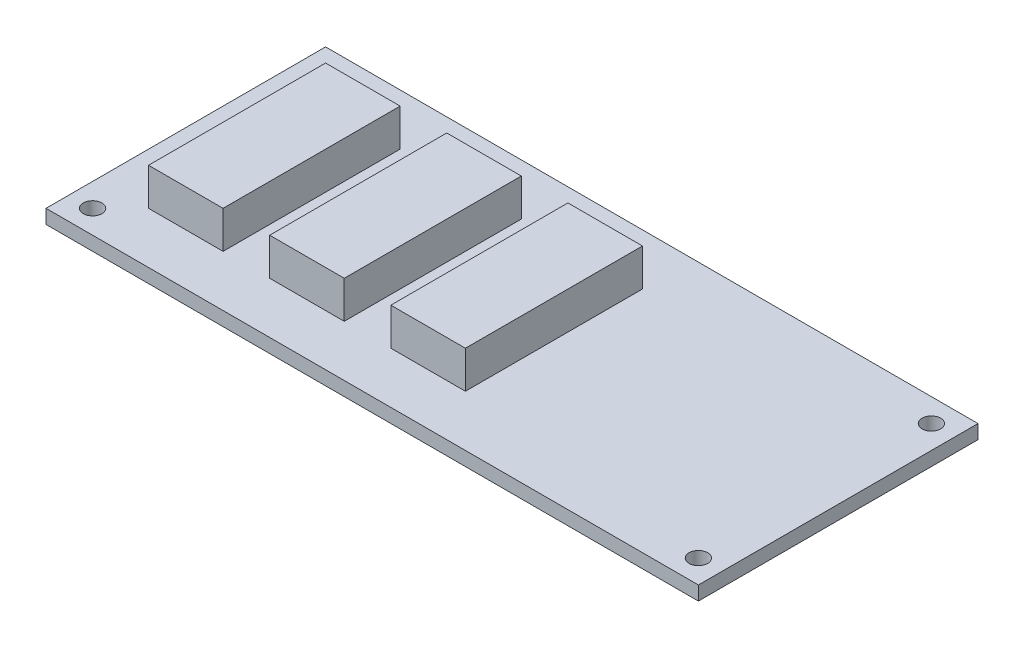
ISO-10303-21;
HEADER;
FILE_DESCRIPTION(('STEP AP214'),'2;1');
FILE_NAME('part.step','',(''),(''),'','','');
FILE_SCHEMA(('AUTOMOTIVE_DESIGN { 1 0 10303 214 1 1 1 1 }'));
ENDSEC;
DATA;
#1=APPLICATION_CONTEXT('core data for automotive mechanical design processes');
#2=APPLICATION_PROTOCOL_DEFINITION('international standard','automotive_design',2000,#1);
#3=PRODUCT_CONTEXT('',#1,'mechanical');
#4=PRODUCT('Part','Part','',(#3));
#5=PRODUCT_RELATED_PRODUCT_CATEGORY('part','',(#4));
#6=PRODUCT_DEFINITION_FORMATION('','',#4);
#7=PRODUCT_DEFINITION_CONTEXT('part definition',#1,'design');
#8=PRODUCT_DEFINITION('design','',#6,#7);
#9=PRODUCT_DEFINITION_SHAPE('','',#8);
#10=(LENGTH_UNIT() NAMED_UNIT(*) SI_UNIT(.MILLI.,.METRE.));
#11=(NAMED_UNIT(*) PLANE_ANGLE_UNIT() SI_UNIT($,.RADIAN.));
#12=(NAMED_UNIT(*) SI_UNIT($,.STERADIAN.) SOLID_ANGLE_UNIT());
#13=UNCERTAINTY_MEASURE_WITH_UNIT(LENGTH_MEASURE(1.E-05),#10,'distance_accuracy_value','');
#14=(GEOMETRIC_REPRESENTATION_CONTEXT(3) GLOBAL_UNCERTAINTY_ASSIGNED_CONTEXT((#13)) GLOBAL_UNIT_ASSIGNED_CONTEXT((#10,
#11,#12)) REPRESENTATION_CONTEXT('',''));
#15=CARTESIAN_POINT('',(0.,0.,0.));
#16=DIRECTION('',(0.,0.,1.));
#17=DIRECTION('',(1.,0.,0.));
#18=AXIS2_PLACEMENT_3D('',#15,#16,#17);
#19=CARTESIAN_POINT('',(0.,1.5,0.));
#20=DIRECTION('',(0.,1.,0.));
#21=DIRECTION('',(0.,0.,1.));
#22=AXIS2_PLACEMENT_3D('',#19,#20,#21);
#23=PLANE('',#22);
#24=CARTESIAN_POINT('',(32.5,1.5,12.5));
#25=DIRECTION('',(0.,1.,0.));
#26=DIRECTION('',(0.,0.,1.));
#27=AXIS2_PLACEMENT_3D('',#24,#25,#26);
#28=CIRCLE('',#27,0.999999999999998);
#29=CARTESIAN_POINT('',(32.5,1.5,13.5));
#30=VERTEX_POINT('',#29);
#31=EDGE_CURVE('E239',#30,#30,#28,.T.);
#32=ORIENTED_EDGE('',*,*,#31,.F.);
#33=EDGE_LOOP('',(#32));
#34=FACE_BOUND('',#33,.T.);
#35=CARTESIAN_POINT('',(-32.5,1.5,-12.5));
#36=DIRECTION('',(0.,1.,0.));
#37=DIRECTION('',(0.,0.,1.));
#38=AXIS2_PLACEMENT_3D('',#35,#36,#37);
#39=CIRCLE('',#38,0.999999999999998);
#40=CARTESIAN_POINT('',(-32.5,1.5,-11.5));
#41=VERTEX_POINT('',#40);
#42=EDGE_CURVE('E251',#41,#41,#39,.T.);
#43=ORIENTED_EDGE('',*,*,#42,.F.);
#44=EDGE_LOOP('',(#43));
#45=FACE_BOUND('',#44,.T.);
#46=DIRECTION('',(0.,0.,-1.));
#47=VECTOR('',#46,1.);
#48=CARTESIAN_POINT('',(35.,1.5,-15.));
#49=LINE('',#48,#47);
#50=CARTESIAN_POINT('',(35.,1.5,15.));
#51=VERTEX_POINT('',#50);
#52=CARTESIAN_POINT('',(35.,1.5,-15.));
#53=VERTEX_POINT('',#52);
#54=EDGE_CURVE('E257',#51,#53,#49,.T.);
#55=ORIENTED_EDGE('',*,*,#54,.T.);
#56=DIRECTION('',(-1.,0.,0.));
#57=VECTOR('',#56,1.);
#58=CARTESIAN_POINT('',(-35.,1.5,-15.));
#59=LINE('',#58,#57);
#60=CARTESIAN_POINT('',(-35.,1.5,-15.));
#61=VERTEX_POINT('',#60);
#62=EDGE_CURVE('E260',#53,#61,#59,.T.);
#63=ORIENTED_EDGE('',*,*,#62,.T.);
#64=DIRECTION('',(0.,0.,1.));
#65=VECTOR('',#64,1.);
#66=CARTESIAN_POINT('',(-35.,1.5,-15.));
#67=LINE('',#66,#65);
#68=CARTESIAN_POINT('',(-35.,1.5,15.));
#69=VERTEX_POINT('',#68);
#70=EDGE_CURVE('E263',#61,#69,#67,.T.);
#71=ORIENTED_EDGE('',*,*,#70,.T.);
#72=DIRECTION('',(1.,0.,0.));
#73=VECTOR('',#72,1.);
#74=CARTESIAN_POINT('',(-35.,1.5,15.));
#75=LINE('',#74,#73);
#76=EDGE_CURVE('E265',#69,#51,#75,.T.);
#77=ORIENTED_EDGE('',*,*,#76,.T.);
#78=EDGE_LOOP('',(#55,#63,#71,#77));
#79=FACE_BOUND('',#78,.T.);
#80=CARTESIAN_POINT('',(32.5,1.5,-12.5));
#81=DIRECTION('',(0.,1.,0.));
#82=DIRECTION('',(0.,0.,1.));
#83=AXIS2_PLACEMENT_3D('',#80,#81,#82);
#84=CIRCLE('',#83,0.999999999999998);
#85=CARTESIAN_POINT('',(32.5,1.5,-11.5));
#86=VERTEX_POINT('',#85);
#87=EDGE_CURVE('E245',#86,#86,#84,.T.);
#88=ORIENTED_EDGE('',*,*,#87,.F.);
#89=EDGE_LOOP('',(#88));
#90=FACE_BOUND('',#89,.T.);
#91=CARTESIAN_POINT('',(-32.5,1.5,12.5));
#92=DIRECTION('',(0.,1.,0.));
#93=DIRECTION('',(0.,0.,1.));
#94=AXIS2_PLACEMENT_3D('',#91,#92,#93);
#95=CIRCLE('',#94,0.999999999999998);
#96=CARTESIAN_POINT('',(-32.5,1.5,13.5));
#97=VERTEX_POINT('',#96);
#98=EDGE_CURVE('E233',#97,#97,#95,.T.);
#99=ORIENTED_EDGE('',*,*,#98,.F.);
#100=EDGE_LOOP('',(#99));
#101=FACE_BOUND('',#100,.T.);
#102=DIRECTION('',(-1.,0.,0.));
#103=VECTOR('',#102,1.);
#104=CARTESIAN_POINT('',(-29.5,1.5,-9.5));
#105=LINE('',#104,#103);
#106=CARTESIAN_POINT('',(-21.5,1.5,-9.5));
#107=VERTEX_POINT('',#106);
#108=CARTESIAN_POINT('',(-29.5,1.5,-9.5));
#109=VERTEX_POINT('',#108);
#110=EDGE_CURVE('E217',#107,#109,#105,.T.);
#111=ORIENTED_EDGE('',*,*,#110,.F.);
#112=DIRECTION('',(0.,0.,-1.));
#113=VECTOR('',#112,1.);
#114=CARTESIAN_POINT('',(-21.5,1.5,-9.5));
#115=LINE('',#114,#113);
#116=CARTESIAN_POINT('',(-21.5,1.5,9.5));
#117=VERTEX_POINT('',#116);
#118=EDGE_CURVE('E203',#117,#107,#115,.T.);
#119=ORIENTED_EDGE('',*,*,#118,.F.);
#120=DIRECTION('',(1.,0.,0.));
#121=VECTOR('',#120,1.);
#122=CARTESIAN_POINT('',(-29.5,1.5,9.5));
#123=LINE('',#122,#121);
#124=CARTESIAN_POINT('',(-29.5,1.5,9.5));
#125=VERTEX_POINT('',#124);
#126=EDGE_CURVE('E208',#125,#117,#123,.T.);
#127=ORIENTED_EDGE('',*,*,#126,.F.);
#128=DIRECTION('',(0.,0.,1.));
#129=VECTOR('',#128,1.);
#130=CARTESIAN_POINT('',(-29.5,1.5,-9.5));
#131=LINE('',#130,#129);
#132=EDGE_CURVE('E219',#109,#125,#131,.T.);
#133=ORIENTED_EDGE('',*,*,#132,.F.);
#134=EDGE_LOOP('',(#111,#119,#127,#133));
#135=FACE_BOUND('',#134,.T.);
#136=DIRECTION('',(-1.,0.,0.));
#137=VECTOR('',#136,1.);
#138=CARTESIAN_POINT('',(-16.5,1.5,-9.5));
#139=LINE('',#138,#137);
#140=CARTESIAN_POINT('',(-8.50000000000001,1.5,-9.5));
#141=VERTEX_POINT('',#140);
#142=CARTESIAN_POINT('',(-16.5,1.5,-9.5));
#143=VERTEX_POINT('',#142);
#144=EDGE_CURVE('E175',#141,#143,#139,.T.);
#145=ORIENTED_EDGE('',*,*,#144,.F.);
#146=DIRECTION('',(0.,0.,-1.));
#147=VECTOR('',#146,1.);
#148=CARTESIAN_POINT('',(-8.50000000000001,1.5,-9.5));
#149=LINE('',#148,#147);
#150=CARTESIAN_POINT('',(-8.50000000000001,1.5,9.5));
#151=VERTEX_POINT('',#150);
#152=EDGE_CURVE('E172',#151,#141,#149,.T.);
#153=ORIENTED_EDGE('',*,*,#152,.F.);
#154=DIRECTION('',(1.,0.,0.));
#155=VECTOR('',#154,1.);
#156=CARTESIAN_POINT('',(-16.5,1.5,9.5));
#157=LINE('',#156,#155);
#158=CARTESIAN_POINT('',(-16.5,1.5,9.5));
#159=VERTEX_POINT('',#158);
#160=EDGE_CURVE('E184',#159,#151,#157,.T.);
#161=ORIENTED_EDGE('',*,*,#160,.F.);
#162=DIRECTION('',(0.,0.,1.));
#163=VECTOR('',#162,1.);
#164=CARTESIAN_POINT('',(-16.5,1.5,-9.5));
#165=LINE('',#164,#163);
#166=EDGE_CURVE('E192',#143,#159,#165,.T.);
#167=ORIENTED_EDGE('',*,*,#166,.F.);
#168=EDGE_LOOP('',(#145,#153,#161,#167));
#169=FACE_BOUND('',#168,.T.);
#170=DIRECTION('',(-1.,0.,0.));
#171=VECTOR('',#170,1.);
#172=CARTESIAN_POINT('',(-3.50000000000001,1.5,-9.5));
#173=LINE('',#172,#171);
#174=CARTESIAN_POINT('',(4.49999999999999,1.5,-9.5));
#175=VERTEX_POINT('',#174);
#176=CARTESIAN_POINT('',(-3.50000000000001,1.5,-9.5));
#177=VERTEX_POINT('',#176);
#178=EDGE_CURVE('E550',#175,#177,#173,.T.);
#179=ORIENTED_EDGE('',*,*,#178,.F.);
#180=DIRECTION('',(0.,0.,-1.));
#181=VECTOR('',#180,1.);
#182=CARTESIAN_POINT('',(4.49999999999999,1.5,-9.5));
#183=LINE('',#182,#181);
#184=CARTESIAN_POINT('',(4.49999999999999,1.5,9.5));
#185=VERTEX_POINT('',#184);
#186=EDGE_CURVE('E170',#185,#175,#183,.T.);
#187=ORIENTED_EDGE('',*,*,#186,.F.);
#188=DIRECTION('',(1.,0.,0.));
#189=VECTOR('',#188,1.);
#190=CARTESIAN_POINT('',(-3.50000000000001,1.5,9.5));
#191=LINE('',#190,#189);
#192=CARTESIAN_POINT('',(-3.50000000000001,1.5,9.5));
#193=VERTEX_POINT('',#192);
#194=EDGE_CURVE('E166',#193,#185,#191,.T.);
#195=ORIENTED_EDGE('',*,*,#194,.F.);
#196=DIRECTION('',(0.,0.,1.));
#197=VECTOR('',#196,1.);
#198=CARTESIAN_POINT('',(-3.50000000000001,1.5,-9.5));
#199=LINE('',#198,#197);
#200=EDGE_CURVE('E547',#177,#193,#199,.T.);
#201=ORIENTED_EDGE('',*,*,#200,.F.);
#202=EDGE_LOOP('',(#179,#187,#195,#201));
#203=FACE_BOUND('',#202,.T.);
#204=ADVANCED_FACE('F33',(#34,#45,#79,#90,#101,#135,#169,#203),#23,.T.);
#205=CARTESIAN_POINT('',(0.,0.,0.));
#206=DIRECTION('',(0.,1.,0.));
#207=DIRECTION('',(0.,0.,1.));
#208=AXIS2_PLACEMENT_3D('',#205,#206,#207);
#209=PLANE('',#208);
#210=DIRECTION('',(0.,0.,-1.));
#211=VECTOR('',#210,1.);
#212=CARTESIAN_POINT('',(35.,0.,-15.));
#213=LINE('',#212,#211);
#214=CARTESIAN_POINT('',(35.,0.,15.));
#215=VERTEX_POINT('',#214);
#216=CARTESIAN_POINT('',(35.,0.,-15.));
#217=VERTEX_POINT('',#216);
#218=EDGE_CURVE('E254',#215,#217,#213,.T.);
#219=ORIENTED_EDGE('',*,*,#218,.F.);
#220=DIRECTION('',(1.,0.,0.));
#221=VECTOR('',#220,1.);
#222=CARTESIAN_POINT('',(-35.,0.,15.));
#223=LINE('',#222,#221);
#224=CARTESIAN_POINT('',(-35.,0.,15.));
#225=VERTEX_POINT('',#224);
#226=EDGE_CURVE('E261',#225,#215,#223,.T.);
#227=ORIENTED_EDGE('',*,*,#226,.F.);
#228=DIRECTION('',(0.,0.,1.));
#229=VECTOR('',#228,1.);
#230=CARTESIAN_POINT('',(-35.,0.,-15.));
#231=LINE('',#230,#229);
#232=CARTESIAN_POINT('',(-35.,0.,-15.));
#233=VERTEX_POINT('',#232);
#234=EDGE_CURVE('E272',#233,#225,#231,.T.);
#235=ORIENTED_EDGE('',*,*,#234,.F.);
#236=DIRECTION('',(-1.,0.,0.));
#237=VECTOR('',#236,1.);
#238=CARTESIAN_POINT('',(-35.,0.,-15.));
#239=LINE('',#238,#237);
#240=EDGE_CURVE('E270',#217,#233,#239,.T.);
#241=ORIENTED_EDGE('',*,*,#240,.F.);
#242=EDGE_LOOP('',(#219,#227,#235,#241));
#243=FACE_BOUND('',#242,.T.);
#244=CARTESIAN_POINT('',(-32.5,0.,-12.5));
#245=DIRECTION('',(0.,1.,0.));
#246=DIRECTION('',(0.,0.,1.));
#247=AXIS2_PLACEMENT_3D('',#244,#245,#246);
#248=CIRCLE('',#247,0.999999999999998);
#249=CARTESIAN_POINT('',(-32.5,0.,-11.5));
#250=VERTEX_POINT('',#249);
#251=EDGE_CURVE('E248',#250,#250,#248,.T.);
#252=ORIENTED_EDGE('',*,*,#251,.T.);
#253=EDGE_LOOP('',(#252));
#254=FACE_BOUND('',#253,.T.);
#255=CARTESIAN_POINT('',(32.5,0.,-12.5));
#256=DIRECTION('',(0.,1.,0.));
#257=DIRECTION('',(0.,0.,1.));
#258=AXIS2_PLACEMENT_3D('',#255,#256,#257);
#259=CIRCLE('',#258,0.999999999999998);
#260=CARTESIAN_POINT('',(32.5,0.,-11.5));
#261=VERTEX_POINT('',#260);
#262=EDGE_CURVE('E242',#261,#261,#259,.T.);
#263=ORIENTED_EDGE('',*,*,#262,.T.);
#264=EDGE_LOOP('',(#263));
#265=FACE_BOUND('',#264,.T.);
#266=CARTESIAN_POINT('',(32.5,0.,12.5));
#267=DIRECTION('',(0.,1.,0.));
#268=DIRECTION('',(0.,0.,1.));
#269=AXIS2_PLACEMENT_3D('',#266,#267,#268);
#270=CIRCLE('',#269,0.999999999999998);
#271=CARTESIAN_POINT('',(32.5,0.,13.5));
#272=VERTEX_POINT('',#271);
#273=EDGE_CURVE('E236',#272,#272,#270,.T.);
#274=ORIENTED_EDGE('',*,*,#273,.T.);
#275=EDGE_LOOP('',(#274));
#276=FACE_BOUND('',#275,.T.);
#277=CARTESIAN_POINT('',(-32.5,0.,12.5));
#278=DIRECTION('',(0.,1.,0.));
#279=DIRECTION('',(0.,0.,1.));
#280=AXIS2_PLACEMENT_3D('',#277,#278,#279);
#281=CIRCLE('',#280,0.999999999999998);
#282=CARTESIAN_POINT('',(-32.5,0.,13.5));
#283=VERTEX_POINT('',#282);
#284=EDGE_CURVE('E232',#283,#283,#281,.T.);
#285=ORIENTED_EDGE('',*,*,#284,.T.);
#286=EDGE_LOOP('',(#285));
#287=FACE_BOUND('',#286,.T.);
#288=ADVANCED_FACE('F290',(#243,#254,#265,#276,#287),#209,.F.);
#289=CARTESIAN_POINT('',(35.,1.5,-15.));
#290=DIRECTION('',(-1.,0.,0.));
#291=DIRECTION('',(0.,0.,1.));
#292=AXIS2_PLACEMENT_3D('',#289,#290,#291);
#293=PLANE('',#292);
#294=ORIENTED_EDGE('',*,*,#218,.T.);
#295=DIRECTION('',(0.,-1.,0.));
#296=VECTOR('',#295,1.);
#297=CARTESIAN_POINT('',(35.,1.5,-15.));
#298=LINE('',#297,#296);
#299=EDGE_CURVE('E11',#53,#217,#298,.T.);
#300=ORIENTED_EDGE('',*,*,#299,.F.);
#301=ORIENTED_EDGE('',*,*,#54,.F.);
#302=DIRECTION('',(0.,-1.,0.));
#303=VECTOR('',#302,1.);
#304=CARTESIAN_POINT('',(35.,1.5,15.));
#305=LINE('',#304,#303);
#306=EDGE_CURVE('E267',#51,#215,#305,.T.);
#307=ORIENTED_EDGE('',*,*,#306,.T.);
#308=EDGE_LOOP('',(#294,#300,#301,#307));
#309=FACE_BOUND('',#308,.T.);
#310=ADVANCED_FACE('F35',(#309),#293,.F.);
#311=CARTESIAN_POINT('',(-35.,1.5,-15.));
#312=DIRECTION('',(0.,0.,1.));
#313=DIRECTION('',(1.,0.,0.));
#314=AXIS2_PLACEMENT_3D('',#311,#312,#313);
#315=PLANE('',#314);
#316=ORIENTED_EDGE('',*,*,#240,.T.);
#317=DIRECTION('',(0.,-1.,0.));
#318=VECTOR('',#317,1.);
#319=CARTESIAN_POINT('',(-35.,1.5,-15.));
#320=LINE('',#319,#318);
#321=EDGE_CURVE('E41',#61,#233,#320,.T.);
#322=ORIENTED_EDGE('',*,*,#321,.F.);
#323=ORIENTED_EDGE('',*,*,#62,.F.);
#324=ORIENTED_EDGE('',*,*,#299,.T.);
#325=EDGE_LOOP('',(#316,#322,#323,#324));
#326=FACE_BOUND('',#325,.T.);
#327=ADVANCED_FACE('F301',(#326),#315,.F.);
#328=CARTESIAN_POINT('',(-35.,1.5,-15.));
#329=DIRECTION('',(1.,0.,0.));
#330=DIRECTION('',(0.,0.,-1.));
#331=AXIS2_PLACEMENT_3D('',#328,#329,#330);
#332=PLANE('',#331);
#333=ORIENTED_EDGE('',*,*,#234,.T.);
#334=DIRECTION('',(0.,-1.,0.));
#335=VECTOR('',#334,1.);
#336=CARTESIAN_POINT('',(-35.,1.5,15.));
#337=LINE('',#336,#335);
#338=EDGE_CURVE('E277',#69,#225,#337,.T.);
#339=ORIENTED_EDGE('',*,*,#338,.F.);
#340=ORIENTED_EDGE('',*,*,#70,.F.);
#341=ORIENTED_EDGE('',*,*,#321,.T.);
#342=EDGE_LOOP('',(#333,#339,#340,#341));
#343=FACE_BOUND('',#342,.T.);
#344=ADVANCED_FACE('F284',(#343),#332,.F.);
#345=CARTESIAN_POINT('',(-35.,1.5,15.));
#346=DIRECTION('',(0.,0.,-1.));
#347=DIRECTION('',(-1.,0.,0.));
#348=AXIS2_PLACEMENT_3D('',#345,#346,#347);
#349=PLANE('',#348);
#350=ORIENTED_EDGE('',*,*,#226,.T.);
#351=ORIENTED_EDGE('',*,*,#306,.F.);
#352=ORIENTED_EDGE('',*,*,#76,.F.);
#353=ORIENTED_EDGE('',*,*,#338,.T.);
#354=EDGE_LOOP('',(#350,#351,#352,#353));
#355=FACE_BOUND('',#354,.T.);
#356=ADVANCED_FACE('F294',(#355),#349,.F.);
#357=CARTESIAN_POINT('',(-32.5,1.5,-12.5));
#358=DIRECTION('',(0.,-1.,0.));
#359=DIRECTION('',(0.,0.,-1.));
#360=AXIS2_PLACEMENT_3D('',#357,#358,#359);
#361=CYLINDRICAL_SURFACE('',#360,0.999999999999998);
#362=ORIENTED_EDGE('',*,*,#42,.T.);
#363=EDGE_LOOP('',(#362));
#364=FACE_BOUND('',#363,.T.);
#365=ORIENTED_EDGE('',*,*,#251,.F.);
#366=EDGE_LOOP('',(#365));
#367=FACE_BOUND('',#366,.T.);
#368=ADVANCED_FACE('F320',(#364,#367),#361,.F.);
#369=CARTESIAN_POINT('',(32.5,1.5,-12.5));
#370=DIRECTION('',(0.,-1.,0.));
#371=DIRECTION('',(0.,0.,-1.));
#372=AXIS2_PLACEMENT_3D('',#369,#370,#371);
#373=CYLINDRICAL_SURFACE('',#372,0.999999999999998);
#374=ORIENTED_EDGE('',*,*,#87,.T.);
#375=EDGE_LOOP('',(#374));
#376=FACE_BOUND('',#375,.T.);
#377=ORIENTED_EDGE('',*,*,#262,.F.);
#378=EDGE_LOOP('',(#377));
#379=FACE_BOUND('',#378,.T.);
#380=ADVANCED_FACE('F327',(#376,#379),#373,.F.);
#381=CARTESIAN_POINT('',(32.5,1.5,12.5));
#382=DIRECTION('',(0.,-1.,0.));
#383=DIRECTION('',(0.,0.,-1.));
#384=AXIS2_PLACEMENT_3D('',#381,#382,#383);
#385=CYLINDRICAL_SURFACE('',#384,0.999999999999998);
#386=ORIENTED_EDGE('',*,*,#31,.T.);
#387=EDGE_LOOP('',(#386));
#388=FACE_BOUND('',#387,.T.);
#389=ORIENTED_EDGE('',*,*,#273,.F.);
#390=EDGE_LOOP('',(#389));
#391=FACE_BOUND('',#390,.T.);
#392=ADVANCED_FACE('F332',(#388,#391),#385,.F.);
#393=CARTESIAN_POINT('',(-32.5,1.5,12.5));
#394=DIRECTION('',(0.,-1.,0.));
#395=DIRECTION('',(0.,0.,-1.));
#396=AXIS2_PLACEMENT_3D('',#393,#394,#395);
#397=CYLINDRICAL_SURFACE('',#396,0.999999999999998);
#398=ORIENTED_EDGE('',*,*,#98,.T.);
#399=EDGE_LOOP('',(#398));
#400=FACE_BOUND('',#399,.T.);
#401=ORIENTED_EDGE('',*,*,#284,.F.);
#402=EDGE_LOOP('',(#401));
#403=FACE_BOUND('',#402,.T.);
#404=ADVANCED_FACE('F344',(#400,#403),#397,.F.);
#405=CARTESIAN_POINT('',(-21.5,5.5,-9.5));
#406=DIRECTION('',(-1.,0.,0.));
#407=DIRECTION('',(0.,0.,1.));
#408=AXIS2_PLACEMENT_3D('',#405,#406,#407);
#409=PLANE('',#408);
#410=ORIENTED_EDGE('',*,*,#118,.T.);
#411=DIRECTION('',(0.,-1.,0.));
#412=VECTOR('',#411,1.);
#413=CARTESIAN_POINT('',(-21.5,5.5,-9.5));
#414=LINE('',#413,#412);
#415=CARTESIAN_POINT('',(-21.5,5.5,-9.5));
#416=VERTEX_POINT('',#415);
#417=EDGE_CURVE('E230',#416,#107,#414,.T.);
#418=ORIENTED_EDGE('',*,*,#417,.F.);
#419=DIRECTION('',(0.,0.,-1.));
#420=VECTOR('',#419,1.);
#421=CARTESIAN_POINT('',(-21.5,5.5,-9.5));
#422=LINE('',#421,#420);
#423=CARTESIAN_POINT('',(-21.5,5.5,9.5));
#424=VERTEX_POINT('',#423);
#425=EDGE_CURVE('E204',#424,#416,#422,.T.);
#426=ORIENTED_EDGE('',*,*,#425,.F.);
#427=DIRECTION('',(0.,-1.,0.));
#428=VECTOR('',#427,1.);
#429=CARTESIAN_POINT('',(-21.5,5.5,9.5));
#430=LINE('',#429,#428);
#431=EDGE_CURVE('E214',#424,#117,#430,.T.);
#432=ORIENTED_EDGE('',*,*,#431,.T.);
#433=EDGE_LOOP('',(#410,#418,#426,#432));
#434=FACE_BOUND('',#433,.T.);
#435=ADVANCED_FACE('F346',(#434),#409,.F.);
#436=CARTESIAN_POINT('',(-29.5,5.5,-9.5));
#437=DIRECTION('',(0.,0.,1.));
#438=DIRECTION('',(1.,0.,0.));
#439=AXIS2_PLACEMENT_3D('',#436,#437,#438);
#440=PLANE('',#439);
#441=ORIENTED_EDGE('',*,*,#110,.T.);
#442=DIRECTION('',(0.,-1.,0.));
#443=VECTOR('',#442,1.);
#444=CARTESIAN_POINT('',(-29.5,5.5,-9.5));
#445=LINE('',#444,#443);
#446=CARTESIAN_POINT('',(-29.5,5.5,-9.5));
#447=VERTEX_POINT('',#446);
#448=EDGE_CURVE('E227',#447,#109,#445,.T.);
#449=ORIENTED_EDGE('',*,*,#448,.F.);
#450=DIRECTION('',(-1.,0.,0.));
#451=VECTOR('',#450,1.);
#452=CARTESIAN_POINT('',(-29.5,5.5,-9.5));
#453=LINE('',#452,#451);
#454=EDGE_CURVE('E207',#416,#447,#453,.T.);
#455=ORIENTED_EDGE('',*,*,#454,.F.);
#456=ORIENTED_EDGE('',*,*,#417,.T.);
#457=EDGE_LOOP('',(#441,#449,#455,#456));
#458=FACE_BOUND('',#457,.T.);
#459=ADVANCED_FACE('F353',(#458),#440,.F.);
#460=CARTESIAN_POINT('',(-29.5,5.5,-9.5));
#461=DIRECTION('',(1.,0.,0.));
#462=DIRECTION('',(0.,0.,-1.));
#463=AXIS2_PLACEMENT_3D('',#460,#461,#462);
#464=PLANE('',#463);
#465=ORIENTED_EDGE('',*,*,#132,.T.);
#466=DIRECTION('',(0.,-1.,0.));
#467=VECTOR('',#466,1.);
#468=CARTESIAN_POINT('',(-29.5,5.5,9.5));
#469=LINE('',#468,#467);
#470=CARTESIAN_POINT('',(-29.5,5.5,9.5));
#471=VERTEX_POINT('',#470);
#472=EDGE_CURVE('E225',#471,#125,#469,.T.);
#473=ORIENTED_EDGE('',*,*,#472,.F.);
#474=DIRECTION('',(0.,0.,1.));
#475=VECTOR('',#474,1.);
#476=CARTESIAN_POINT('',(-29.5,5.5,-9.5));
#477=LINE('',#476,#475);
#478=EDGE_CURVE('E210',#447,#471,#477,.T.);
#479=ORIENTED_EDGE('',*,*,#478,.F.);
#480=ORIENTED_EDGE('',*,*,#448,.T.);
#481=EDGE_LOOP('',(#465,#473,#479,#480));
#482=FACE_BOUND('',#481,.T.);
#483=ADVANCED_FACE('F361',(#482),#464,.F.);
#484=CARTESIAN_POINT('',(-29.5,5.5,9.5));
#485=DIRECTION('',(0.,0.,-1.));
#486=DIRECTION('',(-1.,0.,0.));
#487=AXIS2_PLACEMENT_3D('',#484,#485,#486);
#488=PLANE('',#487);
#489=ORIENTED_EDGE('',*,*,#126,.T.);
#490=ORIENTED_EDGE('',*,*,#431,.F.);
#491=DIRECTION('',(1.,0.,0.));
#492=VECTOR('',#491,1.);
#493=CARTESIAN_POINT('',(-29.5,5.5,9.5));
#494=LINE('',#493,#492);
#495=EDGE_CURVE('E212',#471,#424,#494,.T.);
#496=ORIENTED_EDGE('',*,*,#495,.F.);
#497=ORIENTED_EDGE('',*,*,#472,.T.);
#498=EDGE_LOOP('',(#489,#490,#496,#497));
#499=FACE_BOUND('',#498,.T.);
#500=ADVANCED_FACE('F365',(#499),#488,.F.);
#501=CARTESIAN_POINT('',(0.,5.5,0.));
#502=DIRECTION('',(0.,1.,0.));
#503=DIRECTION('',(0.,0.,1.));
#504=AXIS2_PLACEMENT_3D('',#501,#502,#503);
#505=PLANE('',#504);
#506=ORIENTED_EDGE('',*,*,#425,.T.);
#507=ORIENTED_EDGE('',*,*,#454,.T.);
#508=ORIENTED_EDGE('',*,*,#478,.T.);
#509=ORIENTED_EDGE('',*,*,#495,.T.);
#510=EDGE_LOOP('',(#506,#507,#508,#509));
#511=FACE_BOUND('',#510,.T.);
#512=ADVANCED_FACE('F369',(#511),#505,.T.);
#513=CARTESIAN_POINT('',(-8.50000000000001,5.5,-9.5));
#514=DIRECTION('',(-1.,0.,0.));
#515=DIRECTION('',(0.,0.,1.));
#516=AXIS2_PLACEMENT_3D('',#513,#514,#515);
#517=PLANE('',#516);
#518=ORIENTED_EDGE('',*,*,#152,.T.);
#519=DIRECTION('',(0.,-1.,0.));
#520=VECTOR('',#519,1.);
#521=CARTESIAN_POINT('',(-8.50000000000001,5.5,-9.5));
#522=LINE('',#521,#520);
#523=CARTESIAN_POINT('',(-8.50000000000001,5.5,-9.5));
#524=VERTEX_POINT('',#523);
#525=EDGE_CURVE('E201',#524,#141,#522,.T.);
#526=ORIENTED_EDGE('',*,*,#525,.F.);
#527=DIRECTION('',(0.,0.,-1.));
#528=VECTOR('',#527,1.);
#529=CARTESIAN_POINT('',(-8.50000000000001,5.5,-9.5));
#530=LINE('',#529,#528);
#531=CARTESIAN_POINT('',(-8.50000000000001,5.5,9.5));
#532=VERTEX_POINT('',#531);
#533=EDGE_CURVE('E180',#532,#524,#530,.T.);
#534=ORIENTED_EDGE('',*,*,#533,.F.);
#535=DIRECTION('',(0.,-1.,0.));
#536=VECTOR('',#535,1.);
#537=CARTESIAN_POINT('',(-8.50000000000001,5.5,9.5));
#538=LINE('',#537,#536);
#539=EDGE_CURVE('E189',#532,#151,#538,.T.);
#540=ORIENTED_EDGE('',*,*,#539,.T.);
#541=EDGE_LOOP('',(#518,#526,#534,#540));
#542=FACE_BOUND('',#541,.T.);
#543=ADVANCED_FACE('F373',(#542),#517,.F.);
#544=CARTESIAN_POINT('',(-16.5,5.5,-9.5));
#545=DIRECTION('',(0.,0.,1.));
#546=DIRECTION('',(1.,0.,0.));
#547=AXIS2_PLACEMENT_3D('',#544,#545,#546);
#548=PLANE('',#547);
#549=ORIENTED_EDGE('',*,*,#144,.T.);
#550=DIRECTION('',(0.,-1.,0.));
#551=VECTOR('',#550,1.);
#552=CARTESIAN_POINT('',(-16.5,5.5,-9.5));
#553=LINE('',#552,#551);
#554=CARTESIAN_POINT('',(-16.5,5.5,-9.5));
#555=VERTEX_POINT('',#554);
#556=EDGE_CURVE('E198',#555,#143,#553,.T.);
#557=ORIENTED_EDGE('',*,*,#556,.F.);
#558=DIRECTION('',(-1.,0.,0.));
#559=VECTOR('',#558,1.);
#560=CARTESIAN_POINT('',(-16.5,5.5,-9.5));
#561=LINE('',#560,#559);
#562=EDGE_CURVE('E183',#524,#555,#561,.T.);
#563=ORIENTED_EDGE('',*,*,#562,.F.);
#564=ORIENTED_EDGE('',*,*,#525,.T.);
#565=EDGE_LOOP('',(#549,#557,#563,#564));
#566=FACE_BOUND('',#565,.T.);
#567=ADVANCED_FACE('F377',(#566),#548,.F.);
#568=CARTESIAN_POINT('',(-16.5,5.5,-9.5));
#569=DIRECTION('',(1.,0.,0.));
#570=DIRECTION('',(0.,0.,-1.));
#571=AXIS2_PLACEMENT_3D('',#568,#569,#570);
#572=PLANE('',#571);
#573=ORIENTED_EDGE('',*,*,#166,.T.);
#574=DIRECTION('',(0.,-1.,0.));
#575=VECTOR('',#574,1.);
#576=CARTESIAN_POINT('',(-16.5,5.5,9.5));
#577=LINE('',#576,#575);
#578=CARTESIAN_POINT('',(-16.5,5.5,9.5));
#579=VERTEX_POINT('',#578);
#580=EDGE_CURVE('E56',#579,#159,#577,.T.);
#581=ORIENTED_EDGE('',*,*,#580,.F.);
#582=DIRECTION('',(0.,0.,1.));
#583=VECTOR('',#582,1.);
#584=CARTESIAN_POINT('',(-16.5,5.5,-9.5));
#585=LINE('',#584,#583);
#586=EDGE_CURVE('E186',#555,#579,#585,.T.);
#587=ORIENTED_EDGE('',*,*,#586,.F.);
#588=ORIENTED_EDGE('',*,*,#556,.T.);
#589=EDGE_LOOP('',(#573,#581,#587,#588));
#590=FACE_BOUND('',#589,.T.);
#591=ADVANCED_FACE('F381',(#590),#572,.F.);
#592=CARTESIAN_POINT('',(-16.5,5.5,9.5));
#593=DIRECTION('',(0.,0.,-1.));
#594=DIRECTION('',(-1.,0.,0.));
#595=AXIS2_PLACEMENT_3D('',#592,#593,#594);
#596=PLANE('',#595);
#597=ORIENTED_EDGE('',*,*,#160,.T.);
#598=ORIENTED_EDGE('',*,*,#539,.F.);
#599=DIRECTION('',(1.,0.,0.));
#600=VECTOR('',#599,1.);
#601=CARTESIAN_POINT('',(-16.5,5.5,9.5));
#602=LINE('',#601,#600);
#603=EDGE_CURVE('E188',#579,#532,#602,.T.);
#604=ORIENTED_EDGE('',*,*,#603,.F.);
#605=ORIENTED_EDGE('',*,*,#580,.T.);
#606=EDGE_LOOP('',(#597,#598,#604,#605));
#607=FACE_BOUND('',#606,.T.);
#608=ADVANCED_FACE('F385',(#607),#596,.F.);
#609=CARTESIAN_POINT('',(0.,5.5,0.));
#610=DIRECTION('',(0.,1.,0.));
#611=DIRECTION('',(0.,0.,1.));
#612=AXIS2_PLACEMENT_3D('',#609,#610,#611);
#613=PLANE('',#612);
#614=ORIENTED_EDGE('',*,*,#533,.T.);
#615=ORIENTED_EDGE('',*,*,#562,.T.);
#616=ORIENTED_EDGE('',*,*,#586,.T.);
#617=ORIENTED_EDGE('',*,*,#603,.T.);
#618=EDGE_LOOP('',(#614,#615,#616,#617));
#619=FACE_BOUND('',#618,.T.);
#620=ADVANCED_FACE('F389',(#619),#613,.T.);
#621=CARTESIAN_POINT('',(4.49999999999999,5.5,-9.5));
#622=DIRECTION('',(-1.,0.,0.));
#623=DIRECTION('',(0.,0.,1.));
#624=AXIS2_PLACEMENT_3D('',#621,#622,#623);
#625=PLANE('',#624);
#626=ORIENTED_EDGE('',*,*,#186,.T.);
#627=DIRECTION('',(0.,-1.,0.));
#628=VECTOR('',#627,1.);
#629=CARTESIAN_POINT('',(4.49999999999999,5.5,-9.5));
#630=LINE('',#629,#628);
#631=CARTESIAN_POINT('',(4.49999999999999,5.5,-9.5));
#632=VERTEX_POINT('',#631);
#633=EDGE_CURVE('E151',#632,#175,#630,.T.);
#634=ORIENTED_EDGE('',*,*,#633,.F.);
#635=DIRECTION('',(0.,0.,-1.));
#636=VECTOR('',#635,1.);
#637=CARTESIAN_POINT('',(4.49999999999999,5.5,-9.5));
#638=LINE('',#637,#636);
#639=CARTESIAN_POINT('',(4.49999999999999,5.5,9.5));
#640=VERTEX_POINT('',#639);
#641=EDGE_CURVE('E158',#640,#632,#638,.T.);
#642=ORIENTED_EDGE('',*,*,#641,.F.);
#643=DIRECTION('',(0.,-1.,0.));
#644=VECTOR('',#643,1.);
#645=CARTESIAN_POINT('',(4.49999999999999,5.5,9.5));
#646=LINE('',#645,#644);
#647=EDGE_CURVE('E544',#640,#185,#646,.T.);
#648=ORIENTED_EDGE('',*,*,#647,.T.);
#649=EDGE_LOOP('',(#626,#634,#642,#648));
#650=FACE_BOUND('',#649,.T.);
#651=ADVANCED_FACE('F168',(#650),#625,.F.);
#652=CARTESIAN_POINT('',(-3.50000000000001,5.5,-9.5));
#653=DIRECTION('',(0.,0.,1.));
#654=DIRECTION('',(1.,0.,0.));
#655=AXIS2_PLACEMENT_3D('',#652,#653,#654);
#656=PLANE('',#655);
#657=ORIENTED_EDGE('',*,*,#178,.T.);
#658=DIRECTION('',(0.,-1.,0.));
#659=VECTOR('',#658,1.);
#660=CARTESIAN_POINT('',(-3.50000000000001,5.5,-9.5));
#661=LINE('',#660,#659);
#662=CARTESIAN_POINT('',(-3.50000000000001,5.5,-9.5));
#663=VERTEX_POINT('',#662);
#664=EDGE_CURVE('E154',#663,#177,#661,.T.);
#665=ORIENTED_EDGE('',*,*,#664,.F.);
#666=DIRECTION('',(-1.,0.,0.));
#667=VECTOR('',#666,1.);
#668=CARTESIAN_POINT('',(-3.50000000000001,5.5,-9.5));
#669=LINE('',#668,#667);
#670=EDGE_CURVE('E147',#632,#663,#669,.T.);
#671=ORIENTED_EDGE('',*,*,#670,.F.);
#672=ORIENTED_EDGE('',*,*,#633,.T.);
#673=EDGE_LOOP('',(#657,#665,#671,#672));
#674=FACE_BOUND('',#673,.T.);
#675=ADVANCED_FACE('F149',(#674),#656,.F.);
#676=CARTESIAN_POINT('',(-3.50000000000001,5.5,-9.5));
#677=DIRECTION('',(1.,0.,0.));
#678=DIRECTION('',(0.,0.,-1.));
#679=AXIS2_PLACEMENT_3D('',#676,#677,#678);
#680=PLANE('',#679);
#681=ORIENTED_EDGE('',*,*,#200,.T.);
#682=DIRECTION('',(0.,-1.,0.));
#683=VECTOR('',#682,1.);
#684=CARTESIAN_POINT('',(-3.50000000000001,5.5,9.5));
#685=LINE('',#684,#683);
#686=CARTESIAN_POINT('',(-3.50000000000001,5.5,9.5));
#687=VERTEX_POINT('',#686);
#688=EDGE_CURVE('E48',#687,#193,#685,.T.);
#689=ORIENTED_EDGE('',*,*,#688,.F.);
#690=DIRECTION('',(0.,0.,1.));
#691=VECTOR('',#690,1.);
#692=CARTESIAN_POINT('',(-3.50000000000001,5.5,-9.5));
#693=LINE('',#692,#691);
#694=EDGE_CURVE('E157',#663,#687,#693,.T.);
#695=ORIENTED_EDGE('',*,*,#694,.F.);
#696=ORIENTED_EDGE('',*,*,#664,.T.);
#697=EDGE_LOOP('',(#681,#689,#695,#696));
#698=FACE_BOUND('',#697,.T.);
#699=ADVANCED_FACE('F397',(#698),#680,.F.);
#700=CARTESIAN_POINT('',(-3.50000000000001,5.5,9.5));
#701=DIRECTION('',(0.,0.,-1.));
#702=DIRECTION('',(-1.,0.,0.));
#703=AXIS2_PLACEMENT_3D('',#700,#701,#702);
#704=PLANE('',#703);
#705=ORIENTED_EDGE('',*,*,#194,.T.);
#706=ORIENTED_EDGE('',*,*,#647,.F.);
#707=DIRECTION('',(1.,0.,0.));
#708=VECTOR('',#707,1.);
#709=CARTESIAN_POINT('',(-3.50000000000001,5.5,9.5));
#710=LINE('',#709,#708);
#711=EDGE_CURVE('E162',#687,#640,#710,.T.);
#712=ORIENTED_EDGE('',*,*,#711,.F.);
#713=ORIENTED_EDGE('',*,*,#688,.T.);
#714=EDGE_LOOP('',(#705,#706,#712,#713));
#715=FACE_BOUND('',#714,.T.);
#716=ADVANCED_FACE('F400',(#715),#704,.F.);
#717=CARTESIAN_POINT('',(0.,5.5,0.));
#718=DIRECTION('',(0.,1.,0.));
#719=DIRECTION('',(0.,0.,1.));
#720=AXIS2_PLACEMENT_3D('',#717,#718,#719);
#721=PLANE('',#720);
#722=ORIENTED_EDGE('',*,*,#641,.T.);
#723=ORIENTED_EDGE('',*,*,#670,.T.);
#724=ORIENTED_EDGE('',*,*,#694,.T.);
#725=ORIENTED_EDGE('',*,*,#711,.T.);
#726=EDGE_LOOP('',(#722,#723,#724,#725));
#727=FACE_BOUND('',#726,.T.);
#728=ADVANCED_FACE('F161',(#727),#721,.T.);
#729=CLOSED_SHELL('',(#204,#288,#310,#327,#344,#356,#368,#380,#392,#404,#435,#459,#483,#500,
#512,#543,#567,#591,#608,#620,#651,#675,#699,#716,#728));
#730=MANIFOLD_SOLID_BREP('B2',#729);
#731=ADVANCED_BREP_SHAPE_REPRESENTATION('',(#18,#730),#14);
#732=SHAPE_DEFINITION_REPRESENTATION(#9,#731);
ENDSEC;
END-ISO-10303-21;
